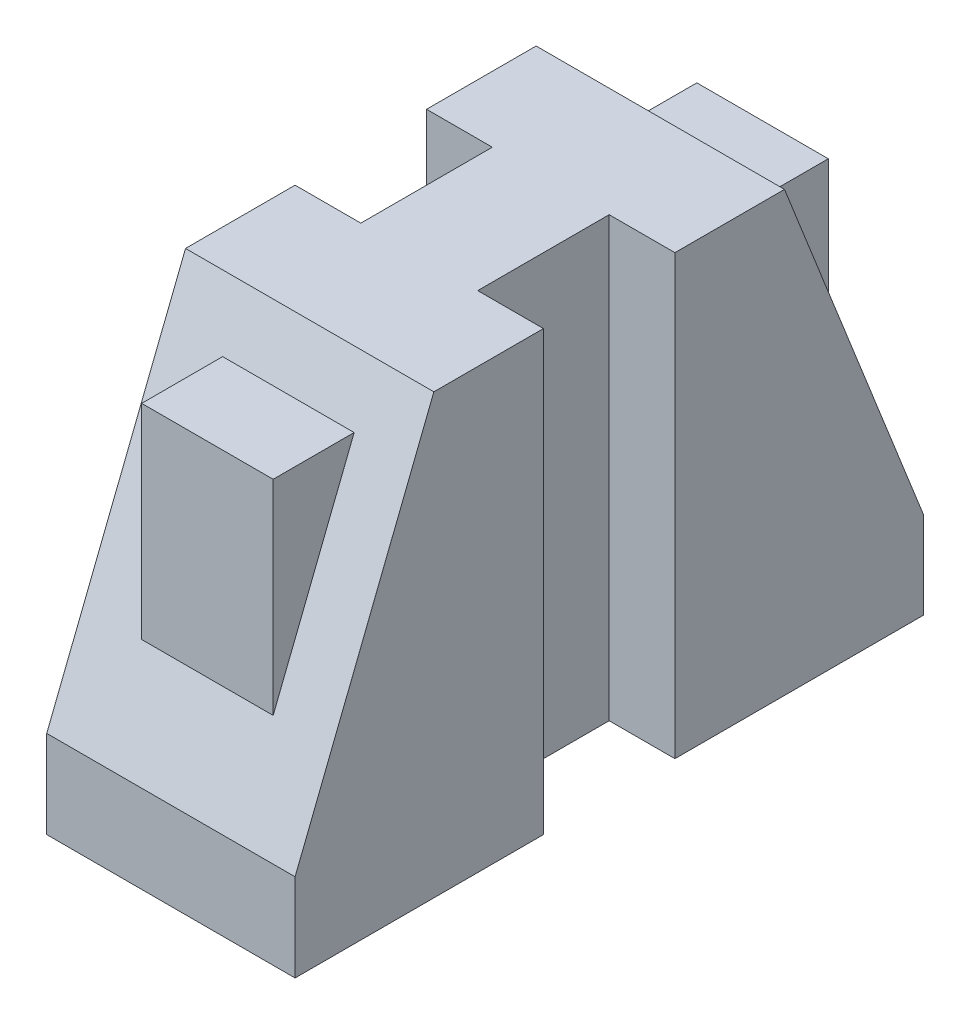
ISO-10303-21;
HEADER;
FILE_DESCRIPTION(('STEP AP214'),'2;1');
FILE_NAME('part.step','',(''),(''),'','','');
FILE_SCHEMA(('AUTOMOTIVE_DESIGN { 1 0 10303 214 1 1 1 1 }'));
ENDSEC;
DATA;
#1=APPLICATION_CONTEXT('core data for automotive mechanical design processes');
#2=APPLICATION_PROTOCOL_DEFINITION('international standard','automotive_design',2000,#1);
#3=PRODUCT_CONTEXT('',#1,'mechanical');
#4=PRODUCT('Part','Part','',(#3));
#5=PRODUCT_RELATED_PRODUCT_CATEGORY('part','',(#4));
#6=PRODUCT_DEFINITION_FORMATION('','',#4);
#7=PRODUCT_DEFINITION_CONTEXT('part definition',#1,'design');
#8=PRODUCT_DEFINITION('design','',#6,#7);
#9=PRODUCT_DEFINITION_SHAPE('','',#8);
#10=(LENGTH_UNIT() NAMED_UNIT(*) SI_UNIT(.MILLI.,.METRE.));
#11=(NAMED_UNIT(*) PLANE_ANGLE_UNIT() SI_UNIT($,.RADIAN.));
#12=(NAMED_UNIT(*) SI_UNIT($,.STERADIAN.) SOLID_ANGLE_UNIT());
#13=UNCERTAINTY_MEASURE_WITH_UNIT(LENGTH_MEASURE(1.E-05),#10,'distance_accuracy_value','');
#14=(GEOMETRIC_REPRESENTATION_CONTEXT(3) GLOBAL_UNCERTAINTY_ASSIGNED_CONTEXT((#13)) GLOBAL_UNIT_ASSIGNED_CONTEXT((#10,
#11,#12)) REPRESENTATION_CONTEXT('',''));
#15=CARTESIAN_POINT('',(0.,0.,0.));
#16=DIRECTION('',(0.,0.,1.));
#17=DIRECTION('',(1.,0.,0.));
#18=AXIS2_PLACEMENT_3D('',#15,#16,#17);
#19=CARTESIAN_POINT('',(-17.,0.,-43.));
#20=DIRECTION('',(0.,0.368048451007379,-0.929806613071272));
#21=DIRECTION('',(0.,0.929806613071272,0.368048451007379));
#22=AXIS2_PLACEMENT_3D('',#19,#20,#21);
#23=PLANE('',#22);
#24=DIRECTION('',(0.,0.929806613071272,0.368048451007379));
#25=VECTOR('',#24,1.);
#26=CARTESIAN_POINT('',(17.,0.,-43.));
#27=LINE('',#26,#25);
#28=CARTESIAN_POINT('',(17.,0.,-43.));
#29=VERTEX_POINT('',#28);
#30=CARTESIAN_POINT('',(17.,48.,-24.));
#31=VERTEX_POINT('',#30);
#32=EDGE_CURVE('E247',#29,#31,#27,.T.);
#33=ORIENTED_EDGE('',*,*,#32,.F.);
#34=DIRECTION('',(1.,0.,0.));
#35=VECTOR('',#34,1.);
#36=CARTESIAN_POINT('',(-17.,0.,-43.));
#37=LINE('',#36,#35);
#38=CARTESIAN_POINT('',(-17.,0.,-43.));
#39=VERTEX_POINT('',#38);
#40=EDGE_CURVE('E11',#39,#29,#37,.T.);
#41=ORIENTED_EDGE('',*,*,#40,.F.);
#42=DIRECTION('',(0.,0.929806613071272,0.368048451007379));
#43=VECTOR('',#42,1.);
#44=CARTESIAN_POINT('',(-17.,0.,-43.));
#45=LINE('',#44,#43);
#46=CARTESIAN_POINT('',(-17.,48.,-24.));
#47=VERTEX_POINT('',#46);
#48=EDGE_CURVE('E277',#39,#47,#45,.T.);
#49=ORIENTED_EDGE('',*,*,#48,.T.);
#50=DIRECTION('',(1.,0.,0.));
#51=VECTOR('',#50,1.);
#52=CARTESIAN_POINT('',(-17.,48.,-24.));
#53=LINE('',#52,#51);
#54=EDGE_CURVE('E40',#47,#31,#53,.T.);
#55=ORIENTED_EDGE('',*,*,#54,.T.);
#56=EDGE_LOOP('',(#33,#41,#49,#55));
#57=FACE_BOUND('',#56,.T.);
#58=DIRECTION('',(-1.,0.,0.));
#59=VECTOR('',#58,1.);
#60=CARTESIAN_POINT('',(9.,40.6315789473684,-26.9166666666667));
#61=LINE('',#60,#59);
#62=CARTESIAN_POINT('',(9.,40.6315789473684,-26.9166666666667));
#63=VERTEX_POINT('',#62);
#64=CARTESIAN_POINT('',(-9.,40.6315789473684,-26.9166666666667));
#65=VERTEX_POINT('',#64);
#66=EDGE_CURVE('E190',#63,#65,#61,.T.);
#67=ORIENTED_EDGE('',*,*,#66,.T.);
#68=DIRECTION('',(0.,-0.929806613071271,-0.368048451007379));
#69=VECTOR('',#68,1.);
#70=CARTESIAN_POINT('',(-9.,12.6315789473684,-38.));
#71=LINE('',#70,#69);
#72=CARTESIAN_POINT('',(-9.,12.6315789473684,-38.));
#73=VERTEX_POINT('',#72);
#74=EDGE_CURVE('E53',#65,#73,#71,.T.);
#75=ORIENTED_EDGE('',*,*,#74,.T.);
#76=DIRECTION('',(-1.,0.,0.));
#77=VECTOR('',#76,1.);
#78=CARTESIAN_POINT('',(9.,12.6315789473684,-38.));
#79=LINE('',#78,#77);
#80=CARTESIAN_POINT('',(9.,12.6315789473684,-38.));
#81=VERTEX_POINT('',#80);
#82=EDGE_CURVE('E182',#81,#73,#79,.T.);
#83=ORIENTED_EDGE('',*,*,#82,.F.);
#84=DIRECTION('',(0.,-0.929806613071271,-0.368048451007379));
#85=VECTOR('',#84,1.);
#86=CARTESIAN_POINT('',(9.,12.6315789473684,-38.));
#87=LINE('',#86,#85);
#88=EDGE_CURVE('E193',#63,#81,#87,.T.);
#89=ORIENTED_EDGE('',*,*,#88,.F.);
#90=EDGE_LOOP('',(#67,#75,#83,#89));
#91=FACE_BOUND('',#90,.T.);
#92=ADVANCED_FACE('F37',(#57,#91),#23,.T.);
#93=CARTESIAN_POINT('',(-17.,0.,43.));
#94=DIRECTION('',(0.,0.368048451007379,0.929806613071272));
#95=DIRECTION('',(0.,-0.929806613071272,0.368048451007378));
#96=AXIS2_PLACEMENT_3D('',#93,#94,#95);
#97=PLANE('',#96);
#98=DIRECTION('',(0.,-0.929806613071272,0.368048451007378));
#99=VECTOR('',#98,1.);
#100=CARTESIAN_POINT('',(17.,0.,43.));
#101=LINE('',#100,#99);
#102=CARTESIAN_POINT('',(17.,48.,24.));
#103=VERTEX_POINT('',#102);
#104=CARTESIAN_POINT('',(17.,0.,43.));
#105=VERTEX_POINT('',#104);
#106=EDGE_CURVE('E304',#103,#105,#101,.T.);
#107=ORIENTED_EDGE('',*,*,#106,.F.);
#108=DIRECTION('',(1.,0.,0.));
#109=VECTOR('',#108,1.);
#110=CARTESIAN_POINT('',(-17.,48.,24.));
#111=LINE('',#110,#109);
#112=CARTESIAN_POINT('',(-17.,48.,24.));
#113=VERTEX_POINT('',#112);
#114=EDGE_CURVE('E321',#113,#103,#111,.T.);
#115=ORIENTED_EDGE('',*,*,#114,.F.);
#116=DIRECTION('',(0.,-0.929806613071272,0.368048451007378));
#117=VECTOR('',#116,1.);
#118=CARTESIAN_POINT('',(-17.,0.,43.));
#119=LINE('',#118,#117);
#120=CARTESIAN_POINT('',(-17.,0.,43.));
#121=VERTEX_POINT('',#120);
#122=EDGE_CURVE('E285',#113,#121,#119,.T.);
#123=ORIENTED_EDGE('',*,*,#122,.T.);
#124=DIRECTION('',(1.,0.,0.));
#125=VECTOR('',#124,1.);
#126=CARTESIAN_POINT('',(-17.,0.,43.));
#127=LINE('',#126,#125);
#128=EDGE_CURVE('E320',#121,#105,#127,.T.);
#129=ORIENTED_EDGE('',*,*,#128,.T.);
#130=EDGE_LOOP('',(#107,#115,#123,#129));
#131=FACE_BOUND('',#130,.T.);
#132=DIRECTION('',(-1.,0.,0.));
#133=VECTOR('',#132,1.);
#134=CARTESIAN_POINT('',(9.,12.6315789473684,38.));
#135=LINE('',#134,#133);
#136=CARTESIAN_POINT('',(9.,12.6315789473684,38.));
#137=VERTEX_POINT('',#136);
#138=CARTESIAN_POINT('',(-9.,12.6315789473684,38.));
#139=VERTEX_POINT('',#138);
#140=EDGE_CURVE('E211',#137,#139,#135,.T.);
#141=ORIENTED_EDGE('',*,*,#140,.T.);
#142=DIRECTION('',(0.,0.929806613071272,-0.368048451007378));
#143=VECTOR('',#142,1.);
#144=CARTESIAN_POINT('',(-9.,12.6315789473684,38.));
#145=LINE('',#144,#143);
#146=CARTESIAN_POINT('',(-9.,40.6315789473684,26.9166666666667));
#147=VERTEX_POINT('',#146);
#148=EDGE_CURVE('E61',#139,#147,#145,.T.);
#149=ORIENTED_EDGE('',*,*,#148,.T.);
#150=DIRECTION('',(-1.,0.,0.));
#151=VECTOR('',#150,1.);
#152=CARTESIAN_POINT('',(9.,40.6315789473684,26.9166666666667));
#153=LINE('',#152,#151);
#154=CARTESIAN_POINT('',(9.,40.6315789473684,26.9166666666667));
#155=VERTEX_POINT('',#154);
#156=EDGE_CURVE('E221',#155,#147,#153,.T.);
#157=ORIENTED_EDGE('',*,*,#156,.F.);
#158=DIRECTION('',(0.,0.929806613071272,-0.368048451007378));
#159=VECTOR('',#158,1.);
#160=CARTESIAN_POINT('',(9.,12.6315789473684,38.));
#161=LINE('',#160,#159);
#162=EDGE_CURVE('E203',#137,#155,#161,.T.);
#163=ORIENTED_EDGE('',*,*,#162,.F.);
#164=EDGE_LOOP('',(#141,#149,#157,#163));
#165=FACE_BOUND('',#164,.T.);
#166=ADVANCED_FACE('F367',(#131,#165),#97,.T.);
#167=CARTESIAN_POINT('',(-17.,0.,0.));
#168=DIRECTION('',(-1.,0.,0.));
#169=DIRECTION('',(0.,0.,1.));
#170=AXIS2_PLACEMENT_3D('',#167,#168,#169);
#171=PLANE('',#170);
#172=DIRECTION('',(0.,1.,0.));
#173=VECTOR('',#172,1.);
#174=CARTESIAN_POINT('',(-17.,-12.,-9.));
#175=LINE('',#174,#173);
#176=CARTESIAN_POINT('',(-17.,-12.,-9.));
#177=VERTEX_POINT('',#176);
#178=CARTESIAN_POINT('',(-17.,48.,-8.99999999999999));
#179=VERTEX_POINT('',#178);
#180=EDGE_CURVE('E244',#177,#179,#175,.T.);
#181=ORIENTED_EDGE('',*,*,#180,.T.);
#182=DIRECTION('',(0.,0.,1.));
#183=VECTOR('',#182,1.);
#184=CARTESIAN_POINT('',(-17.,48.,24.));
#185=LINE('',#184,#183);
#186=EDGE_CURVE('E282',#47,#179,#185,.T.);
#187=ORIENTED_EDGE('',*,*,#186,.F.);
#188=ORIENTED_EDGE('',*,*,#48,.F.);
#189=DIRECTION('',(0.,1.,0.));
#190=VECTOR('',#189,1.);
#191=CARTESIAN_POINT('',(-17.,-12.,-43.));
#192=LINE('',#191,#190);
#193=CARTESIAN_POINT('',(-17.,-12.,-43.));
#194=VERTEX_POINT('',#193);
#195=EDGE_CURVE('E295',#194,#39,#192,.T.);
#196=ORIENTED_EDGE('',*,*,#195,.F.);
#197=DIRECTION('',(0.,0.,-1.));
#198=VECTOR('',#197,1.);
#199=CARTESIAN_POINT('',(-17.,-12.,-43.));
#200=LINE('',#199,#198);
#201=EDGE_CURVE('E291',#177,#194,#200,.T.);
#202=ORIENTED_EDGE('',*,*,#201,.F.);
#203=EDGE_LOOP('',(#181,#187,#188,#196,#202));
#204=FACE_BOUND('',#203,.T.);
#205=ADVANCED_FACE('F347',(#204),#171,.T.);
#206=CARTESIAN_POINT('',(17.,0.,0.));
#207=DIRECTION('',(-1.,0.,0.));
#208=DIRECTION('',(0.,0.,1.));
#209=AXIS2_PLACEMENT_3D('',#206,#207,#208);
#210=PLANE('',#209);
#211=DIRECTION('',(0.,0.,-1.));
#212=VECTOR('',#211,1.);
#213=CARTESIAN_POINT('',(17.,-12.,-43.));
#214=LINE('',#213,#212);
#215=CARTESIAN_POINT('',(17.,-12.,43.));
#216=VERTEX_POINT('',#215);
#217=CARTESIAN_POINT('',(17.,-12.,8.99999999999999));
#218=VERTEX_POINT('',#217);
#219=EDGE_CURVE('E311',#216,#218,#214,.T.);
#220=ORIENTED_EDGE('',*,*,#219,.T.);
#221=DIRECTION('',(0.,1.,0.));
#222=VECTOR('',#221,1.);
#223=CARTESIAN_POINT('',(17.,-12.,8.99999999999999));
#224=LINE('',#223,#222);
#225=CARTESIAN_POINT('',(17.,48.,9.));
#226=VERTEX_POINT('',#225);
#227=EDGE_CURVE('E224',#218,#226,#224,.T.);
#228=ORIENTED_EDGE('',*,*,#227,.T.);
#229=DIRECTION('',(0.,0.,1.));
#230=VECTOR('',#229,1.);
#231=CARTESIAN_POINT('',(17.,48.,24.));
#232=LINE('',#231,#230);
#233=EDGE_CURVE('E300',#226,#103,#232,.T.);
#234=ORIENTED_EDGE('',*,*,#233,.T.);
#235=ORIENTED_EDGE('',*,*,#106,.T.);
#236=DIRECTION('',(0.,-1.,0.));
#237=VECTOR('',#236,1.);
#238=CARTESIAN_POINT('',(17.,-12.,43.));
#239=LINE('',#238,#237);
#240=EDGE_CURVE('E307',#105,#216,#239,.T.);
#241=ORIENTED_EDGE('',*,*,#240,.T.);
#242=EDGE_LOOP('',(#220,#228,#234,#235,#241));
#243=FACE_BOUND('',#242,.T.);
#244=ADVANCED_FACE('F371',(#243),#210,.F.);
#245=CARTESIAN_POINT('',(-17.,-12.,-43.));
#246=DIRECTION('',(0.,0.,-1.));
#247=DIRECTION('',(0.,1.,0.));
#248=AXIS2_PLACEMENT_3D('',#245,#246,#247);
#249=PLANE('',#248);
#250=DIRECTION('',(0.,1.,0.));
#251=VECTOR('',#250,1.);
#252=CARTESIAN_POINT('',(17.,-12.,-43.));
#253=LINE('',#252,#251);
#254=CARTESIAN_POINT('',(17.,-12.,-43.));
#255=VERTEX_POINT('',#254);
#256=EDGE_CURVE('E281',#255,#29,#253,.T.);
#257=ORIENTED_EDGE('',*,*,#256,.F.);
#258=DIRECTION('',(1.,0.,0.));
#259=VECTOR('',#258,1.);
#260=CARTESIAN_POINT('',(-17.,-12.,-43.));
#261=LINE('',#260,#259);
#262=EDGE_CURVE('E45',#194,#255,#261,.T.);
#263=ORIENTED_EDGE('',*,*,#262,.F.);
#264=ORIENTED_EDGE('',*,*,#195,.T.);
#265=ORIENTED_EDGE('',*,*,#40,.T.);
#266=EDGE_LOOP('',(#257,#263,#264,#265));
#267=FACE_BOUND('',#266,.T.);
#268=ADVANCED_FACE('F344',(#267),#249,.T.);
#269=CARTESIAN_POINT('',(-17.,-12.,-43.));
#270=DIRECTION('',(0.,-1.,0.));
#271=DIRECTION('',(0.,0.,-1.));
#272=AXIS2_PLACEMENT_3D('',#269,#270,#271);
#273=PLANE('',#272);
#274=DIRECTION('',(-1.,0.,0.));
#275=VECTOR('',#274,1.);
#276=CARTESIAN_POINT('',(-17.,-12.,-9.));
#277=LINE('',#276,#275);
#278=CARTESIAN_POINT('',(-8.,-12.,-9.));
#279=VERTEX_POINT('',#278);
#280=EDGE_CURVE('E232',#279,#177,#277,.T.);
#281=ORIENTED_EDGE('',*,*,#280,.T.);
#282=ORIENTED_EDGE('',*,*,#201,.T.);
#283=ORIENTED_EDGE('',*,*,#262,.T.);
#284=CARTESIAN_POINT('',(17.,-12.,-9.));
#285=VERTEX_POINT('',#284);
#286=EDGE_CURVE('E310',#285,#255,#214,.T.);
#287=ORIENTED_EDGE('',*,*,#286,.F.);
#288=DIRECTION('',(-1.,0.,0.));
#289=VECTOR('',#288,1.);
#290=CARTESIAN_POINT('',(17.,-12.,-9.));
#291=LINE('',#290,#289);
#292=CARTESIAN_POINT('',(8.,-12.,-9.));
#293=VERTEX_POINT('',#292);
#294=EDGE_CURVE('E265',#285,#293,#291,.T.);
#295=ORIENTED_EDGE('',*,*,#294,.T.);
#296=DIRECTION('',(0.,0.,1.));
#297=VECTOR('',#296,1.);
#298=CARTESIAN_POINT('',(8.,-12.,-9.));
#299=LINE('',#298,#297);
#300=CARTESIAN_POINT('',(8.00000000000001,-12.,8.99999999999999));
#301=VERTEX_POINT('',#300);
#302=EDGE_CURVE('E272',#293,#301,#299,.T.);
#303=ORIENTED_EDGE('',*,*,#302,.T.);
#304=DIRECTION('',(1.,0.,0.));
#305=VECTOR('',#304,1.);
#306=CARTESIAN_POINT('',(17.,-12.,8.99999999999999));
#307=LINE('',#306,#305);
#308=EDGE_CURVE('E255',#301,#218,#307,.T.);
#309=ORIENTED_EDGE('',*,*,#308,.T.);
#310=ORIENTED_EDGE('',*,*,#219,.F.);
#311=DIRECTION('',(1.,0.,0.));
#312=VECTOR('',#311,1.);
#313=CARTESIAN_POINT('',(-17.,-12.,43.));
#314=LINE('',#313,#312);
#315=CARTESIAN_POINT('',(-17.,-12.,43.));
#316=VERTEX_POINT('',#315);
#317=EDGE_CURVE('E318',#316,#216,#314,.T.);
#318=ORIENTED_EDGE('',*,*,#317,.F.);
#319=CARTESIAN_POINT('',(-17.,-12.,8.99999999999999));
#320=VERTEX_POINT('',#319);
#321=EDGE_CURVE('E292',#316,#320,#200,.T.);
#322=ORIENTED_EDGE('',*,*,#321,.T.);
#323=DIRECTION('',(1.,0.,0.));
#324=VECTOR('',#323,1.);
#325=CARTESIAN_POINT('',(-17.,-12.,8.99999999999999));
#326=LINE('',#325,#324);
#327=CARTESIAN_POINT('',(-8.,-12.,8.99999999999999));
#328=VERTEX_POINT('',#327);
#329=EDGE_CURVE('E225',#320,#328,#326,.T.);
#330=ORIENTED_EDGE('',*,*,#329,.T.);
#331=DIRECTION('',(0.,0.,-1.));
#332=VECTOR('',#331,1.);
#333=CARTESIAN_POINT('',(-8.,-12.,-9.));
#334=LINE('',#333,#332);
#335=EDGE_CURVE('E228',#328,#279,#334,.T.);
#336=ORIENTED_EDGE('',*,*,#335,.T.);
#337=EDGE_LOOP('',(#281,#282,#283,#287,#295,#303,#309,#310,#318,#322,#330,#336));
#338=FACE_BOUND('',#337,.T.);
#339=ADVANCED_FACE('F382',(#338),#273,.T.);
#340=CARTESIAN_POINT('',(-17.,-12.,43.));
#341=DIRECTION('',(0.,0.,1.));
#342=DIRECTION('',(1.,0.,0.));
#343=AXIS2_PLACEMENT_3D('',#340,#341,#342);
#344=PLANE('',#343);
#345=ORIENTED_EDGE('',*,*,#240,.F.);
#346=ORIENTED_EDGE('',*,*,#128,.F.);
#347=DIRECTION('',(0.,-1.,0.));
#348=VECTOR('',#347,1.);
#349=CARTESIAN_POINT('',(-17.,-12.,43.));
#350=LINE('',#349,#348);
#351=EDGE_CURVE('E288',#121,#316,#350,.T.);
#352=ORIENTED_EDGE('',*,*,#351,.T.);
#353=ORIENTED_EDGE('',*,*,#317,.T.);
#354=EDGE_LOOP('',(#345,#346,#352,#353));
#355=FACE_BOUND('',#354,.T.);
#356=ADVANCED_FACE('F385',(#355),#344,.T.);
#357=CARTESIAN_POINT('',(-17.,48.,24.));
#358=DIRECTION('',(0.,1.,0.));
#359=DIRECTION('',(0.,0.,1.));
#360=AXIS2_PLACEMENT_3D('',#357,#358,#359);
#361=PLANE('',#360);
#362=DIRECTION('',(-1.,0.,0.));
#363=VECTOR('',#362,1.);
#364=CARTESIAN_POINT('',(-17.,48.,-8.99999999999999));
#365=LINE('',#364,#363);
#366=CARTESIAN_POINT('',(-8.,48.,-8.99999999999999));
#367=VERTEX_POINT('',#366);
#368=EDGE_CURVE('E229',#367,#179,#365,.T.);
#369=ORIENTED_EDGE('',*,*,#368,.F.);
#370=DIRECTION('',(0.,0.,-1.));
#371=VECTOR('',#370,1.);
#372=CARTESIAN_POINT('',(-8.,48.,-8.99999999999999));
#373=LINE('',#372,#371);
#374=CARTESIAN_POINT('',(-8.,48.,9.));
#375=VERTEX_POINT('',#374);
#376=EDGE_CURVE('E239',#375,#367,#373,.T.);
#377=ORIENTED_EDGE('',*,*,#376,.F.);
#378=DIRECTION('',(1.,0.,0.));
#379=VECTOR('',#378,1.);
#380=CARTESIAN_POINT('',(-17.,48.,9.));
#381=LINE('',#380,#379);
#382=CARTESIAN_POINT('',(-17.,48.,9.));
#383=VERTEX_POINT('',#382);
#384=EDGE_CURVE('E236',#383,#375,#381,.T.);
#385=ORIENTED_EDGE('',*,*,#384,.F.);
#386=EDGE_CURVE('E280',#383,#113,#185,.T.);
#387=ORIENTED_EDGE('',*,*,#386,.T.);
#388=ORIENTED_EDGE('',*,*,#114,.T.);
#389=ORIENTED_EDGE('',*,*,#233,.F.);
#390=DIRECTION('',(1.,0.,0.));
#391=VECTOR('',#390,1.);
#392=CARTESIAN_POINT('',(17.,48.,9.));
#393=LINE('',#392,#391);
#394=CARTESIAN_POINT('',(8.00000000000001,48.,9.));
#395=VERTEX_POINT('',#394);
#396=EDGE_CURVE('E262',#395,#226,#393,.T.);
#397=ORIENTED_EDGE('',*,*,#396,.F.);
#398=DIRECTION('',(0.,0.,1.));
#399=VECTOR('',#398,1.);
#400=CARTESIAN_POINT('',(8.,48.,-8.99999999999999));
#401=LINE('',#400,#399);
#402=CARTESIAN_POINT('',(8.,48.,-8.99999999999999));
#403=VERTEX_POINT('',#402);
#404=EDGE_CURVE('E264',#403,#395,#401,.T.);
#405=ORIENTED_EDGE('',*,*,#404,.F.);
#406=DIRECTION('',(-1.,0.,0.));
#407=VECTOR('',#406,1.);
#408=CARTESIAN_POINT('',(17.,48.,-8.99999999999999));
#409=LINE('',#408,#407);
#410=CARTESIAN_POINT('',(17.,48.,-8.99999999999999));
#411=VERTEX_POINT('',#410);
#412=EDGE_CURVE('E240',#411,#403,#409,.T.);
#413=ORIENTED_EDGE('',*,*,#412,.F.);
#414=EDGE_CURVE('E301',#31,#411,#232,.T.);
#415=ORIENTED_EDGE('',*,*,#414,.F.);
#416=ORIENTED_EDGE('',*,*,#54,.F.);
#417=ORIENTED_EDGE('',*,*,#186,.T.);
#418=EDGE_LOOP('',(#369,#377,#385,#387,#388,#389,#397,#405,#413,#415,#416,#417));
#419=FACE_BOUND('',#418,.T.);
#420=ADVANCED_FACE('F335',(#419),#361,.T.);
#421=DIRECTION('',(0.,1.,0.));
#422=VECTOR('',#421,1.);
#423=CARTESIAN_POINT('',(-17.,-12.,8.99999999999999));
#424=LINE('',#423,#422);
#425=EDGE_CURVE('E235',#320,#383,#424,.T.);
#426=ORIENTED_EDGE('',*,*,#425,.F.);
#427=ORIENTED_EDGE('',*,*,#321,.F.);
#428=ORIENTED_EDGE('',*,*,#351,.F.);
#429=ORIENTED_EDGE('',*,*,#122,.F.);
#430=ORIENTED_EDGE('',*,*,#386,.F.);
#431=EDGE_LOOP('',(#426,#427,#428,#429,#430));
#432=FACE_BOUND('',#431,.T.);
#433=ADVANCED_FACE('F363',(#432),#171,.T.);
#434=ORIENTED_EDGE('',*,*,#414,.T.);
#435=DIRECTION('',(0.,1.,0.));
#436=VECTOR('',#435,1.);
#437=CARTESIAN_POINT('',(17.,-12.,-9.));
#438=LINE('',#437,#436);
#439=EDGE_CURVE('E253',#285,#411,#438,.T.);
#440=ORIENTED_EDGE('',*,*,#439,.F.);
#441=ORIENTED_EDGE('',*,*,#286,.T.);
#442=ORIENTED_EDGE('',*,*,#256,.T.);
#443=ORIENTED_EDGE('',*,*,#32,.T.);
#444=EDGE_LOOP('',(#434,#440,#441,#442,#443));
#445=FACE_BOUND('',#444,.T.);
#446=ADVANCED_FACE('F339',(#445),#210,.F.);
#447=CARTESIAN_POINT('',(17.,-12.,8.99999999999999));
#448=DIRECTION('',(0.,0.,1.));
#449=DIRECTION('',(1.,0.,0.));
#450=AXIS2_PLACEMENT_3D('',#447,#448,#449);
#451=PLANE('',#450);
#452=ORIENTED_EDGE('',*,*,#396,.T.);
#453=ORIENTED_EDGE('',*,*,#227,.F.);
#454=ORIENTED_EDGE('',*,*,#308,.F.);
#455=DIRECTION('',(0.,1.,0.));
#456=VECTOR('',#455,1.);
#457=CARTESIAN_POINT('',(8.00000000000001,-12.,8.99999999999999));
#458=LINE('',#457,#456);
#459=EDGE_CURVE('E258',#301,#395,#458,.T.);
#460=ORIENTED_EDGE('',*,*,#459,.T.);
#461=EDGE_LOOP('',(#452,#453,#454,#460));
#462=FACE_BOUND('',#461,.T.);
#463=ADVANCED_FACE('F374',(#462),#451,.F.);
#464=CARTESIAN_POINT('',(8.,-12.,-9.));
#465=DIRECTION('',(-1.,0.,0.));
#466=DIRECTION('',(0.,0.,1.));
#467=AXIS2_PLACEMENT_3D('',#464,#465,#466);
#468=PLANE('',#467);
#469=ORIENTED_EDGE('',*,*,#404,.T.);
#470=ORIENTED_EDGE('',*,*,#459,.F.);
#471=ORIENTED_EDGE('',*,*,#302,.F.);
#472=DIRECTION('',(0.,1.,0.));
#473=VECTOR('',#472,1.);
#474=CARTESIAN_POINT('',(8.,-12.,-9.));
#475=LINE('',#474,#473);
#476=EDGE_CURVE('E256',#293,#403,#475,.T.);
#477=ORIENTED_EDGE('',*,*,#476,.T.);
#478=EDGE_LOOP('',(#469,#470,#471,#477));
#479=FACE_BOUND('',#478,.T.);
#480=ADVANCED_FACE('F378',(#479),#468,.F.);
#481=CARTESIAN_POINT('',(17.,-12.,-9.));
#482=DIRECTION('',(0.,0.,-1.));
#483=DIRECTION('',(-1.,0.,0.));
#484=AXIS2_PLACEMENT_3D('',#481,#482,#483);
#485=PLANE('',#484);
#486=ORIENTED_EDGE('',*,*,#412,.T.);
#487=ORIENTED_EDGE('',*,*,#476,.F.);
#488=ORIENTED_EDGE('',*,*,#294,.F.);
#489=ORIENTED_EDGE('',*,*,#439,.T.);
#490=EDGE_LOOP('',(#486,#487,#488,#489));
#491=FACE_BOUND('',#490,.T.);
#492=ADVANCED_FACE('F380',(#491),#485,.F.);
#493=CARTESIAN_POINT('',(-17.,-12.,-9.));
#494=DIRECTION('',(0.,0.,-1.));
#495=DIRECTION('',(-1.,0.,0.));
#496=AXIS2_PLACEMENT_3D('',#493,#494,#495);
#497=PLANE('',#496);
#498=ORIENTED_EDGE('',*,*,#368,.T.);
#499=ORIENTED_EDGE('',*,*,#180,.F.);
#500=ORIENTED_EDGE('',*,*,#280,.F.);
#501=DIRECTION('',(0.,1.,0.));
#502=VECTOR('',#501,1.);
#503=CARTESIAN_POINT('',(-8.,-12.,-9.));
#504=LINE('',#503,#502);
#505=EDGE_CURVE('E248',#279,#367,#504,.T.);
#506=ORIENTED_EDGE('',*,*,#505,.T.);
#507=EDGE_LOOP('',(#498,#499,#500,#506));
#508=FACE_BOUND('',#507,.T.);
#509=ADVANCED_FACE('F352',(#508),#497,.F.);
#510=CARTESIAN_POINT('',(-8.,-12.,-9.));
#511=DIRECTION('',(1.,0.,0.));
#512=DIRECTION('',(0.,0.,-1.));
#513=AXIS2_PLACEMENT_3D('',#510,#511,#512);
#514=PLANE('',#513);
#515=ORIENTED_EDGE('',*,*,#376,.T.);
#516=ORIENTED_EDGE('',*,*,#505,.F.);
#517=ORIENTED_EDGE('',*,*,#335,.F.);
#518=DIRECTION('',(0.,1.,0.));
#519=VECTOR('',#518,1.);
#520=CARTESIAN_POINT('',(-8.,-12.,8.99999999999999));
#521=LINE('',#520,#519);
#522=EDGE_CURVE('E250',#328,#375,#521,.T.);
#523=ORIENTED_EDGE('',*,*,#522,.T.);
#524=EDGE_LOOP('',(#515,#516,#517,#523));
#525=FACE_BOUND('',#524,.T.);
#526=ADVANCED_FACE('F356',(#525),#514,.F.);
#527=CARTESIAN_POINT('',(-17.,-12.,8.99999999999999));
#528=DIRECTION('',(0.,0.,1.));
#529=DIRECTION('',(0.,-1.,0.));
#530=AXIS2_PLACEMENT_3D('',#527,#528,#529);
#531=PLANE('',#530);
#532=ORIENTED_EDGE('',*,*,#384,.T.);
#533=ORIENTED_EDGE('',*,*,#522,.F.);
#534=ORIENTED_EDGE('',*,*,#329,.F.);
#535=ORIENTED_EDGE('',*,*,#425,.T.);
#536=EDGE_LOOP('',(#532,#533,#534,#535));
#537=FACE_BOUND('',#536,.T.);
#538=ADVANCED_FACE('F358',(#537),#531,.F.);
#539=CARTESIAN_POINT('',(9.,40.6315789473684,38.));
#540=DIRECTION('',(0.,-1.,0.));
#541=DIRECTION('',(0.,0.,-1.));
#542=AXIS2_PLACEMENT_3D('',#539,#540,#541);
#543=PLANE('',#542);
#544=DIRECTION('',(0.,0.,1.));
#545=VECTOR('',#544,1.);
#546=CARTESIAN_POINT('',(-9.,40.6315789473684,38.));
#547=LINE('',#546,#545);
#548=CARTESIAN_POINT('',(-9.,40.6315789473684,38.));
#549=VERTEX_POINT('',#548);
#550=EDGE_CURVE('E213',#147,#549,#547,.T.);
#551=ORIENTED_EDGE('',*,*,#550,.T.);
#552=DIRECTION('',(-1.,0.,0.));
#553=VECTOR('',#552,1.);
#554=CARTESIAN_POINT('',(9.,40.6315789473684,38.));
#555=LINE('',#554,#553);
#556=CARTESIAN_POINT('',(9.,40.6315789473684,38.));
#557=VERTEX_POINT('',#556);
#558=EDGE_CURVE('E218',#557,#549,#555,.T.);
#559=ORIENTED_EDGE('',*,*,#558,.F.);
#560=DIRECTION('',(0.,0.,1.));
#561=VECTOR('',#560,1.);
#562=CARTESIAN_POINT('',(9.,40.6315789473684,38.));
#563=LINE('',#562,#561);
#564=EDGE_CURVE('E206',#155,#557,#563,.T.);
#565=ORIENTED_EDGE('',*,*,#564,.F.);
#566=ORIENTED_EDGE('',*,*,#156,.T.);
#567=EDGE_LOOP('',(#551,#559,#565,#566));
#568=FACE_BOUND('',#567,.T.);
#569=ADVANCED_FACE('F498',(#568),#543,.F.);
#570=CARTESIAN_POINT('',(9.,12.6315789473684,38.));
#571=DIRECTION('',(0.,0.,-1.));
#572=DIRECTION('',(-1.,0.,0.));
#573=AXIS2_PLACEMENT_3D('',#570,#571,#572);
#574=PLANE('',#573);
#575=DIRECTION('',(0.,-1.,0.));
#576=VECTOR('',#575,1.);
#577=CARTESIAN_POINT('',(-9.,12.6315789473684,38.));
#578=LINE('',#577,#576);
#579=EDGE_CURVE('E207',#549,#139,#578,.T.);
#580=ORIENTED_EDGE('',*,*,#579,.T.);
#581=ORIENTED_EDGE('',*,*,#140,.F.);
#582=DIRECTION('',(0.,-1.,0.));
#583=VECTOR('',#582,1.);
#584=CARTESIAN_POINT('',(9.,12.6315789473684,38.));
#585=LINE('',#584,#583);
#586=EDGE_CURVE('E209',#557,#137,#585,.T.);
#587=ORIENTED_EDGE('',*,*,#586,.F.);
#588=ORIENTED_EDGE('',*,*,#558,.T.);
#589=EDGE_LOOP('',(#580,#581,#587,#588));
#590=FACE_BOUND('',#589,.T.);
#591=ADVANCED_FACE('F518',(#590),#574,.F.);
#592=CARTESIAN_POINT('',(9.,0.,0.));
#593=DIRECTION('',(-1.,0.,0.));
#594=DIRECTION('',(0.,0.,1.));
#595=AXIS2_PLACEMENT_3D('',#592,#593,#594);
#596=PLANE('',#595);
#597=ORIENTED_EDGE('',*,*,#162,.T.);
#598=ORIENTED_EDGE('',*,*,#564,.T.);
#599=ORIENTED_EDGE('',*,*,#586,.T.);
#600=EDGE_LOOP('',(#597,#598,#599));
#601=FACE_BOUND('',#600,.T.);
#602=ADVANCED_FACE('F528',(#601),#596,.F.);
#603=CARTESIAN_POINT('',(-9.,0.,0.));
#604=DIRECTION('',(-1.,0.,0.));
#605=DIRECTION('',(0.,0.,1.));
#606=AXIS2_PLACEMENT_3D('',#603,#604,#605);
#607=PLANE('',#606);
#608=ORIENTED_EDGE('',*,*,#148,.F.);
#609=ORIENTED_EDGE('',*,*,#579,.F.);
#610=ORIENTED_EDGE('',*,*,#550,.F.);
#611=EDGE_LOOP('',(#608,#609,#610));
#612=FACE_BOUND('',#611,.T.);
#613=ADVANCED_FACE('F539',(#612),#607,.T.);
#614=CARTESIAN_POINT('',(9.,12.6315789473684,-38.));
#615=DIRECTION('',(0.,0.,1.));
#616=DIRECTION('',(1.,0.,0.));
#617=AXIS2_PLACEMENT_3D('',#614,#615,#616);
#618=PLANE('',#617);
#619=DIRECTION('',(0.,1.,0.));
#620=VECTOR('',#619,1.);
#621=CARTESIAN_POINT('',(-9.,12.6315789473684,-38.));
#622=LINE('',#621,#620);
#623=CARTESIAN_POINT('',(-9.,40.6315789473684,-38.));
#624=VERTEX_POINT('',#623);
#625=EDGE_CURVE('E176',#73,#624,#622,.T.);
#626=ORIENTED_EDGE('',*,*,#625,.T.);
#627=DIRECTION('',(-1.,0.,0.));
#628=VECTOR('',#627,1.);
#629=CARTESIAN_POINT('',(9.,40.6315789473684,-38.));
#630=LINE('',#629,#628);
#631=CARTESIAN_POINT('',(9.,40.6315789473684,-38.));
#632=VERTEX_POINT('',#631);
#633=EDGE_CURVE('E179',#632,#624,#630,.T.);
#634=ORIENTED_EDGE('',*,*,#633,.F.);
#635=DIRECTION('',(0.,1.,0.));
#636=VECTOR('',#635,1.);
#637=CARTESIAN_POINT('',(9.,12.6315789473684,-38.));
#638=LINE('',#637,#636);
#639=EDGE_CURVE('E196',#81,#632,#638,.T.);
#640=ORIENTED_EDGE('',*,*,#639,.F.);
#641=ORIENTED_EDGE('',*,*,#82,.T.);
#642=EDGE_LOOP('',(#626,#634,#640,#641));
#643=FACE_BOUND('',#642,.T.);
#644=ADVANCED_FACE('F178',(#643),#618,.F.);
#645=CARTESIAN_POINT('',(9.,40.6315789473684,-38.));
#646=DIRECTION('',(0.,-1.,0.));
#647=DIRECTION('',(0.,0.,-1.));
#648=AXIS2_PLACEMENT_3D('',#645,#646,#647);
#649=PLANE('',#648);
#650=DIRECTION('',(0.,0.,1.));
#651=VECTOR('',#650,1.);
#652=CARTESIAN_POINT('',(-9.,40.6315789473684,-38.));
#653=LINE('',#652,#651);
#654=EDGE_CURVE('E183',#624,#65,#653,.T.);
#655=ORIENTED_EDGE('',*,*,#654,.T.);
#656=ORIENTED_EDGE('',*,*,#66,.F.);
#657=DIRECTION('',(0.,0.,1.));
#658=VECTOR('',#657,1.);
#659=CARTESIAN_POINT('',(9.,40.6315789473684,-38.));
#660=LINE('',#659,#658);
#661=EDGE_CURVE('E189',#632,#63,#660,.T.);
#662=ORIENTED_EDGE('',*,*,#661,.F.);
#663=ORIENTED_EDGE('',*,*,#633,.T.);
#664=EDGE_LOOP('',(#655,#656,#662,#663));
#665=FACE_BOUND('',#664,.T.);
#666=ADVANCED_FACE('F186',(#665),#649,.F.);
#667=CARTESIAN_POINT('',(9.,0.,0.));
#668=DIRECTION('',(1.,0.,0.));
#669=DIRECTION('',(0.,0.,-1.));
#670=AXIS2_PLACEMENT_3D('',#667,#668,#669);
#671=PLANE('',#670);
#672=ORIENTED_EDGE('',*,*,#88,.T.);
#673=ORIENTED_EDGE('',*,*,#639,.T.);
#674=ORIENTED_EDGE('',*,*,#661,.T.);
#675=EDGE_LOOP('',(#672,#673,#674));
#676=FACE_BOUND('',#675,.T.);
#677=ADVANCED_FACE('F568',(#676),#671,.T.);
#678=CARTESIAN_POINT('',(-9.,0.,0.));
#679=DIRECTION('',(1.,0.,0.));
#680=DIRECTION('',(0.,0.,-1.));
#681=AXIS2_PLACEMENT_3D('',#678,#679,#680);
#682=PLANE('',#681);
#683=ORIENTED_EDGE('',*,*,#74,.F.);
#684=ORIENTED_EDGE('',*,*,#654,.F.);
#685=ORIENTED_EDGE('',*,*,#625,.F.);
#686=EDGE_LOOP('',(#683,#684,#685));
#687=FACE_BOUND('',#686,.T.);
#688=ADVANCED_FACE('F192',(#687),#682,.F.);
#689=CLOSED_SHELL('',(#92,#166,#205,#244,#268,#339,#356,#420,#433,#446,#463,#480,#492,#509,#526,
#538,#569,#591,#602,#613,#644,#666,#677,#688));
#690=MANIFOLD_SOLID_BREP('B2',#689);
#691=ADVANCED_BREP_SHAPE_REPRESENTATION('',(#18,#690),#14);
#692=SHAPE_DEFINITION_REPRESENTATION(#9,#691);
ENDSEC;
END-ISO-10303-21;
